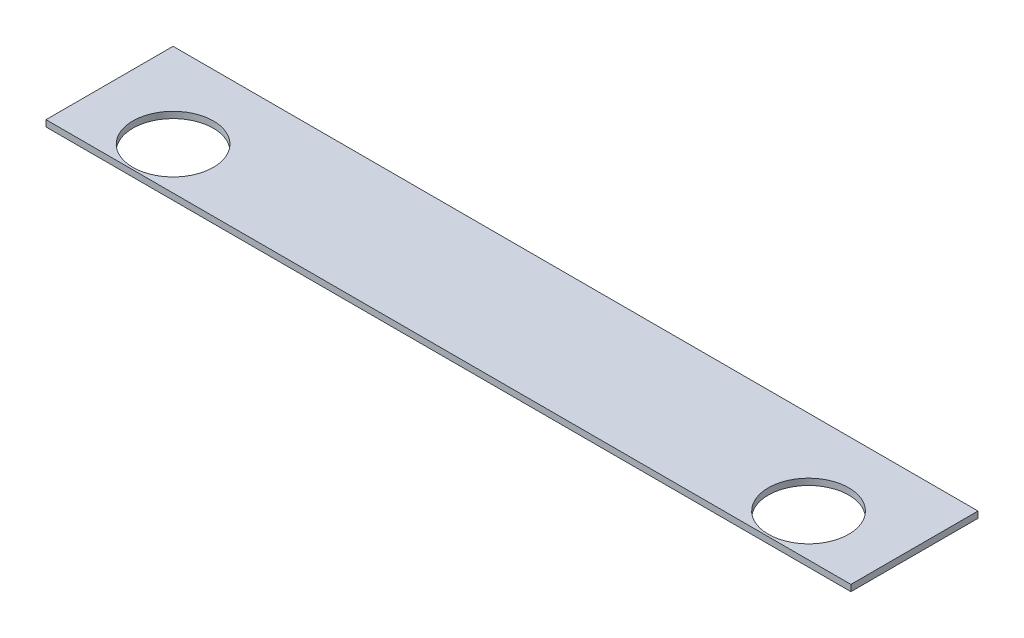
ISO-10303-21;
HEADER;
FILE_DESCRIPTION(('STEP AP214'),'2;1');
FILE_NAME('part.step','',(''),(''),'','','');
FILE_SCHEMA(('AUTOMOTIVE_DESIGN { 1 0 10303 214 1 1 1 1 }'));
ENDSEC;
DATA;
#1=APPLICATION_CONTEXT('core data for automotive mechanical design processes');
#2=APPLICATION_PROTOCOL_DEFINITION('international standard','automotive_design',2000,#1);
#3=PRODUCT_CONTEXT('',#1,'mechanical');
#4=PRODUCT('Part','Part','',(#3));
#5=PRODUCT_RELATED_PRODUCT_CATEGORY('part','',(#4));
#6=PRODUCT_DEFINITION_FORMATION('','',#4);
#7=PRODUCT_DEFINITION_CONTEXT('part definition',#1,'design');
#8=PRODUCT_DEFINITION('design','',#6,#7);
#9=PRODUCT_DEFINITION_SHAPE('','',#8);
#10=(LENGTH_UNIT() NAMED_UNIT(*) SI_UNIT(.MILLI.,.METRE.));
#11=(NAMED_UNIT(*) PLANE_ANGLE_UNIT() SI_UNIT($,.RADIAN.));
#12=(NAMED_UNIT(*) SI_UNIT($,.STERADIAN.) SOLID_ANGLE_UNIT());
#13=UNCERTAINTY_MEASURE_WITH_UNIT(LENGTH_MEASURE(1.E-05),#10,'distance_accuracy_value','');
#14=(GEOMETRIC_REPRESENTATION_CONTEXT(3) GLOBAL_UNCERTAINTY_ASSIGNED_CONTEXT((#13)) GLOBAL_UNIT_ASSIGNED_CONTEXT((#10,
#11,#12)) REPRESENTATION_CONTEXT('',''));
#15=CARTESIAN_POINT('',(0.,0.,0.));
#16=DIRECTION('',(0.,0.,1.));
#17=DIRECTION('',(1.,0.,0.));
#18=AXIS2_PLACEMENT_3D('',#15,#16,#17);
#19=CARTESIAN_POINT('',(0.,0.3,0.));
#20=DIRECTION('',(0.,-1.,0.));
#21=DIRECTION('',(0.,0.,-1.));
#22=AXIS2_PLACEMENT_3D('',#19,#20,#21);
#23=PLANE('',#22);
#24=DIRECTION('',(0.,0.,-1.));
#25=VECTOR('',#24,1.);
#26=CARTESIAN_POINT('',(19.,0.3,3.));
#27=LINE('',#26,#25);
#28=CARTESIAN_POINT('',(19.,0.3,3.));
#29=VERTEX_POINT('',#28);
#30=CARTESIAN_POINT('',(19.,0.3,-3.));
#31=VERTEX_POINT('',#30);
#32=EDGE_CURVE('E88',#29,#31,#27,.T.);
#33=ORIENTED_EDGE('',*,*,#32,.T.);
#34=DIRECTION('',(-1.,0.,0.));
#35=VECTOR('',#34,1.);
#36=CARTESIAN_POINT('',(-19.,0.3,-3.));
#37=LINE('',#36,#35);
#38=CARTESIAN_POINT('',(-19.,0.3,-3.));
#39=VERTEX_POINT('',#38);
#40=EDGE_CURVE('E83',#31,#39,#37,.T.);
#41=ORIENTED_EDGE('',*,*,#40,.T.);
#42=DIRECTION('',(0.,0.,1.));
#43=VECTOR('',#42,1.);
#44=CARTESIAN_POINT('',(-19.,0.3,3.));
#45=LINE('',#44,#43);
#46=CARTESIAN_POINT('',(-19.,0.3,3.));
#47=VERTEX_POINT('',#46);
#48=EDGE_CURVE('E86',#39,#47,#45,.T.);
#49=ORIENTED_EDGE('',*,*,#48,.T.);
#50=DIRECTION('',(1.,0.,0.));
#51=VECTOR('',#50,1.);
#52=CARTESIAN_POINT('',(-19.,0.3,3.));
#53=LINE('',#52,#51);
#54=EDGE_CURVE('E53',#47,#29,#53,.T.);
#55=ORIENTED_EDGE('',*,*,#54,.T.);
#56=EDGE_LOOP('',(#33,#41,#49,#55));
#57=FACE_BOUND('',#56,.T.);
#58=CARTESIAN_POINT('',(-15.,0.3,0.999999999999999));
#59=DIRECTION('',(0.,1.,0.));
#60=DIRECTION('',(0.,0.,1.));
#61=AXIS2_PLACEMENT_3D('',#58,#59,#60);
#62=CIRCLE('',#61,1.9);
#63=CARTESIAN_POINT('',(-15.,0.3,2.9));
#64=VERTEX_POINT('',#63);
#65=EDGE_CURVE('E103',#64,#64,#62,.T.);
#66=ORIENTED_EDGE('',*,*,#65,.F.);
#67=EDGE_LOOP('',(#66));
#68=FACE_BOUND('',#67,.T.);
#69=CARTESIAN_POINT('',(15.,0.3,0.999999999999999));
#70=DIRECTION('',(0.,1.,0.));
#71=DIRECTION('',(0.,0.,1.));
#72=AXIS2_PLACEMENT_3D('',#69,#70,#71);
#73=CIRCLE('',#72,1.9);
#74=CARTESIAN_POINT('',(15.,0.3,2.9));
#75=VERTEX_POINT('',#74);
#76=EDGE_CURVE('E118',#75,#75,#73,.T.);
#77=ORIENTED_EDGE('',*,*,#76,.F.);
#78=EDGE_LOOP('',(#77));
#79=FACE_BOUND('',#78,.T.);
#80=ADVANCED_FACE('F36',(#57,#68,#79),#23,.F.);
#81=CARTESIAN_POINT('',(0.,0.,0.));
#82=DIRECTION('',(0.,-1.,0.));
#83=DIRECTION('',(0.,0.,-1.));
#84=AXIS2_PLACEMENT_3D('',#81,#82,#83);
#85=PLANE('',#84);
#86=CARTESIAN_POINT('',(-15.,0.,0.999999999999999));
#87=DIRECTION('',(0.,1.,0.));
#88=DIRECTION('',(0.,0.,1.));
#89=AXIS2_PLACEMENT_3D('',#86,#87,#88);
#90=CIRCLE('',#89,1.9);
#91=CARTESIAN_POINT('',(-15.,0.,2.9));
#92=VERTEX_POINT('',#91);
#93=EDGE_CURVE('E115',#92,#92,#90,.T.);
#94=ORIENTED_EDGE('',*,*,#93,.T.);
#95=EDGE_LOOP('',(#94));
#96=FACE_BOUND('',#95,.T.);
#97=DIRECTION('',(0.,0.,-1.));
#98=VECTOR('',#97,1.);
#99=CARTESIAN_POINT('',(19.,0.,3.));
#100=LINE('',#99,#98);
#101=CARTESIAN_POINT('',(19.,0.,3.));
#102=VERTEX_POINT('',#101);
#103=CARTESIAN_POINT('',(19.,0.,-3.));
#104=VERTEX_POINT('',#103);
#105=EDGE_CURVE('E100',#102,#104,#100,.T.);
#106=ORIENTED_EDGE('',*,*,#105,.F.);
#107=DIRECTION('',(1.,0.,0.));
#108=VECTOR('',#107,1.);
#109=CARTESIAN_POINT('',(-19.,0.,3.));
#110=LINE('',#109,#108);
#111=CARTESIAN_POINT('',(-19.,0.,3.));
#112=VERTEX_POINT('',#111);
#113=EDGE_CURVE('E76',#112,#102,#110,.T.);
#114=ORIENTED_EDGE('',*,*,#113,.F.);
#115=DIRECTION('',(0.,0.,1.));
#116=VECTOR('',#115,1.);
#117=CARTESIAN_POINT('',(-19.,0.,3.));
#118=LINE('',#117,#116);
#119=CARTESIAN_POINT('',(-19.,0.,-3.));
#120=VERTEX_POINT('',#119);
#121=EDGE_CURVE('E70',#120,#112,#118,.T.);
#122=ORIENTED_EDGE('',*,*,#121,.F.);
#123=DIRECTION('',(-1.,0.,0.));
#124=VECTOR('',#123,1.);
#125=CARTESIAN_POINT('',(-19.,0.,-3.));
#126=LINE('',#125,#124);
#127=EDGE_CURVE('E92',#104,#120,#126,.T.);
#128=ORIENTED_EDGE('',*,*,#127,.F.);
#129=EDGE_LOOP('',(#106,#114,#122,#128));
#130=FACE_BOUND('',#129,.T.);
#131=CARTESIAN_POINT('',(15.,0.,0.999999999999999));
#132=DIRECTION('',(0.,1.,0.));
#133=DIRECTION('',(0.,0.,1.));
#134=AXIS2_PLACEMENT_3D('',#131,#132,#133);
#135=CIRCLE('',#134,1.9);
#136=CARTESIAN_POINT('',(15.,0.,2.9));
#137=VERTEX_POINT('',#136);
#138=EDGE_CURVE('E121',#137,#137,#135,.T.);
#139=ORIENTED_EDGE('',*,*,#138,.T.);
#140=EDGE_LOOP('',(#139));
#141=FACE_BOUND('',#140,.T.);
#142=ADVANCED_FACE('F111',(#96,#130,#141),#85,.T.);
#143=CARTESIAN_POINT('',(19.,0.3,3.));
#144=DIRECTION('',(-1.,0.,0.));
#145=DIRECTION('',(0.,0.,1.));
#146=AXIS2_PLACEMENT_3D('',#143,#144,#145);
#147=PLANE('',#146);
#148=ORIENTED_EDGE('',*,*,#105,.T.);
#149=DIRECTION('',(0.,-1.,0.));
#150=VECTOR('',#149,1.);
#151=CARTESIAN_POINT('',(19.,0.3,-3.));
#152=LINE('',#151,#150);
#153=EDGE_CURVE('E11',#31,#104,#152,.T.);
#154=ORIENTED_EDGE('',*,*,#153,.F.);
#155=ORIENTED_EDGE('',*,*,#32,.F.);
#156=DIRECTION('',(0.,-1.,0.));
#157=VECTOR('',#156,1.);
#158=CARTESIAN_POINT('',(19.,0.3,3.));
#159=LINE('',#158,#157);
#160=EDGE_CURVE('E96',#29,#102,#159,.T.);
#161=ORIENTED_EDGE('',*,*,#160,.T.);
#162=EDGE_LOOP('',(#148,#154,#155,#161));
#163=FACE_BOUND('',#162,.T.);
#164=ADVANCED_FACE('F38',(#163),#147,.F.);
#165=CARTESIAN_POINT('',(-19.,0.3,-3.));
#166=DIRECTION('',(0.,0.,1.));
#167=DIRECTION('',(1.,0.,0.));
#168=AXIS2_PLACEMENT_3D('',#165,#166,#167);
#169=PLANE('',#168);
#170=ORIENTED_EDGE('',*,*,#127,.T.);
#171=DIRECTION('',(0.,-1.,0.));
#172=VECTOR('',#171,1.);
#173=CARTESIAN_POINT('',(-19.,0.3,-3.));
#174=LINE('',#173,#172);
#175=EDGE_CURVE('E45',#39,#120,#174,.T.);
#176=ORIENTED_EDGE('',*,*,#175,.F.);
#177=ORIENTED_EDGE('',*,*,#40,.F.);
#178=ORIENTED_EDGE('',*,*,#153,.T.);
#179=EDGE_LOOP('',(#170,#176,#177,#178));
#180=FACE_BOUND('',#179,.T.);
#181=ADVANCED_FACE('F91',(#180),#169,.F.);
#182=CARTESIAN_POINT('',(-19.,0.3,3.));
#183=DIRECTION('',(1.,0.,0.));
#184=DIRECTION('',(0.,0.,-1.));
#185=AXIS2_PLACEMENT_3D('',#182,#183,#184);
#186=PLANE('',#185);
#187=ORIENTED_EDGE('',*,*,#121,.T.);
#188=DIRECTION('',(0.,-1.,0.));
#189=VECTOR('',#188,1.);
#190=CARTESIAN_POINT('',(-19.,0.3,3.));
#191=LINE('',#190,#189);
#192=EDGE_CURVE('E93',#47,#112,#191,.T.);
#193=ORIENTED_EDGE('',*,*,#192,.F.);
#194=ORIENTED_EDGE('',*,*,#48,.F.);
#195=ORIENTED_EDGE('',*,*,#175,.T.);
#196=EDGE_LOOP('',(#187,#193,#194,#195));
#197=FACE_BOUND('',#196,.T.);
#198=ADVANCED_FACE('F94',(#197),#186,.F.);
#199=CARTESIAN_POINT('',(-19.,0.3,3.));
#200=DIRECTION('',(0.,0.,-1.));
#201=DIRECTION('',(-1.,0.,0.));
#202=AXIS2_PLACEMENT_3D('',#199,#200,#201);
#203=PLANE('',#202);
#204=ORIENTED_EDGE('',*,*,#113,.T.);
#205=ORIENTED_EDGE('',*,*,#160,.F.);
#206=ORIENTED_EDGE('',*,*,#54,.F.);
#207=ORIENTED_EDGE('',*,*,#192,.T.);
#208=EDGE_LOOP('',(#204,#205,#206,#207));
#209=FACE_BOUND('',#208,.T.);
#210=ADVANCED_FACE('F108',(#209),#203,.F.);
#211=CARTESIAN_POINT('',(-15.,0.3,0.999999999999999));
#212=DIRECTION('',(0.,-1.,0.));
#213=DIRECTION('',(0.,0.,-1.));
#214=AXIS2_PLACEMENT_3D('',#211,#212,#213);
#215=CYLINDRICAL_SURFACE('',#214,1.9);
#216=ORIENTED_EDGE('',*,*,#65,.T.);
#217=EDGE_LOOP('',(#216));
#218=FACE_BOUND('',#217,.T.);
#219=ORIENTED_EDGE('',*,*,#93,.F.);
#220=EDGE_LOOP('',(#219));
#221=FACE_BOUND('',#220,.T.);
#222=ADVANCED_FACE('F138',(#218,#221),#215,.F.);
#223=CARTESIAN_POINT('',(15.,0.3,0.999999999999999));
#224=DIRECTION('',(0.,-1.,0.));
#225=DIRECTION('',(0.,0.,-1.));
#226=AXIS2_PLACEMENT_3D('',#223,#224,#225);
#227=CYLINDRICAL_SURFACE('',#226,1.9);
#228=ORIENTED_EDGE('',*,*,#76,.T.);
#229=EDGE_LOOP('',(#228));
#230=FACE_BOUND('',#229,.T.);
#231=ORIENTED_EDGE('',*,*,#138,.F.);
#232=EDGE_LOOP('',(#231));
#233=FACE_BOUND('',#232,.T.);
#234=ADVANCED_FACE('F127',(#230,#233),#227,.F.);
#235=CLOSED_SHELL('',(#80,#142,#164,#181,#198,#210,#222,#234));
#236=MANIFOLD_SOLID_BREP('B2',#235);
#237=ADVANCED_BREP_SHAPE_REPRESENTATION('',(#18,#236),#14);
#238=SHAPE_DEFINITION_REPRESENTATION(#9,#237);
ENDSEC;
END-ISO-10303-21;
